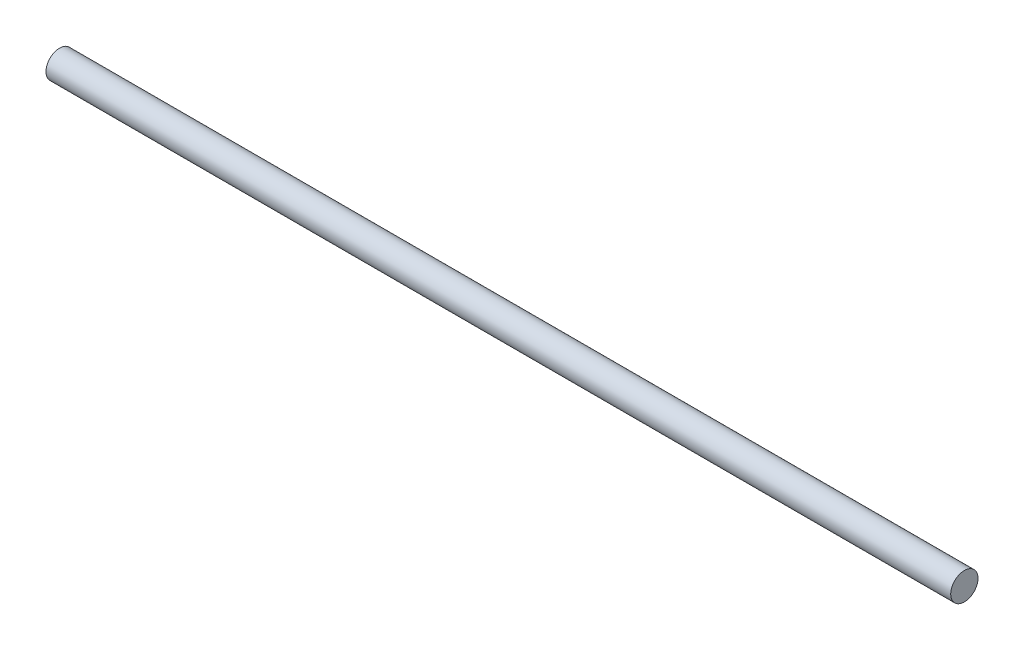
ISO-10303-21;
HEADER;
FILE_DESCRIPTION(('STEP AP214'),'2;1');
FILE_NAME('part.step','',(''),(''),'','','');
FILE_SCHEMA(('AUTOMOTIVE_DESIGN { 1 0 10303 214 1 1 1 1 }'));
ENDSEC;
DATA;
#1=APPLICATION_CONTEXT('core data for automotive mechanical design processes');
#2=APPLICATION_PROTOCOL_DEFINITION('international standard','automotive_design',2000,#1);
#3=PRODUCT_CONTEXT('',#1,'mechanical');
#4=PRODUCT('Part','Part','',(#3));
#5=PRODUCT_RELATED_PRODUCT_CATEGORY('part','',(#4));
#6=PRODUCT_DEFINITION_FORMATION('','',#4);
#7=PRODUCT_DEFINITION_CONTEXT('part definition',#1,'design');
#8=PRODUCT_DEFINITION('design','',#6,#7);
#9=PRODUCT_DEFINITION_SHAPE('','',#8);
#10=(LENGTH_UNIT() NAMED_UNIT(*) SI_UNIT(.MILLI.,.METRE.));
#11=(NAMED_UNIT(*) PLANE_ANGLE_UNIT() SI_UNIT($,.RADIAN.));
#12=(NAMED_UNIT(*) SI_UNIT($,.STERADIAN.) SOLID_ANGLE_UNIT());
#13=UNCERTAINTY_MEASURE_WITH_UNIT(LENGTH_MEASURE(1.E-05),#10,'distance_accuracy_value','');
#14=(GEOMETRIC_REPRESENTATION_CONTEXT(3) GLOBAL_UNCERTAINTY_ASSIGNED_CONTEXT((#13)) GLOBAL_UNIT_ASSIGNED_CONTEXT((#10,
#11,#12)) REPRESENTATION_CONTEXT('',''));
#15=CARTESIAN_POINT('',(0.,0.,0.));
#16=DIRECTION('',(0.,0.,1.));
#17=DIRECTION('',(1.,0.,0.));
#18=AXIS2_PLACEMENT_3D('',#15,#16,#17);
#19=CARTESIAN_POINT('',(497.5,0.,0.));
#20=DIRECTION('',(-1.,0.,0.));
#21=DIRECTION('',(0.,0.,-1.));
#22=AXIS2_PLACEMENT_3D('',#19,#20,#21);
#23=CYLINDRICAL_SURFACE('',#22,7.5);
#24=CARTESIAN_POINT('',(497.5,0.,0.));
#25=DIRECTION('',(-1.,0.,0.));
#26=DIRECTION('',(0.,0.,1.));
#27=AXIS2_PLACEMENT_3D('',#24,#25,#26);
#28=CIRCLE('',#27,7.5);
#29=CARTESIAN_POINT('',(497.5,0.,-7.5));
#30=VERTEX_POINT('',#29);
#31=EDGE_CURVE('E10',#30,#30,#28,.T.);
#32=CARTESIAN_POINT('',(0.,0.,0.));
#33=DIRECTION('',(-1.,0.,0.));
#34=DIRECTION('',(0.,0.,1.));
#35=AXIS2_PLACEMENT_3D('',#32,#33,#34);
#36=CIRCLE('',#35,7.5);
#37=CARTESIAN_POINT('',(0.,0.,-7.5));
#38=VERTEX_POINT('',#37);
#39=EDGE_CURVE('E38',#38,#38,#36,.T.);
#40=CARTESIAN_POINT('',(497.5,0.,-7.5));
#41=CARTESIAN_POINT('',(492.317708333333,0.,-7.5));
#42=CARTESIAN_POINT('',(487.135416666667,0.,-7.5));
#43=CARTESIAN_POINT('',(476.770833333333,0.,-7.5));
#44=CARTESIAN_POINT('',(471.588541666667,0.,-7.5));
#45=CARTESIAN_POINT('',(461.223958333333,0.,-7.5));
#46=CARTESIAN_POINT('',(456.041666666667,0.,-7.5));
#47=CARTESIAN_POINT('',(445.677083333333,0.,-7.5));
#48=CARTESIAN_POINT('',(440.494791666667,0.,-7.5));
#49=CARTESIAN_POINT('',(430.130208333333,0.,-7.5));
#50=CARTESIAN_POINT('',(424.947916666667,0.,-7.5));
#51=CARTESIAN_POINT('',(414.583333333333,0.,-7.5));
#52=CARTESIAN_POINT('',(409.401041666667,0.,-7.5));
#53=CARTESIAN_POINT('',(399.036458333333,0.,-7.5));
#54=CARTESIAN_POINT('',(393.854166666667,0.,-7.5));
#55=CARTESIAN_POINT('',(383.489583333333,0.,-7.5));
#56=CARTESIAN_POINT('',(378.307291666667,0.,-7.5));
#57=CARTESIAN_POINT('',(367.942708333333,0.,-7.5));
#58=CARTESIAN_POINT('',(362.760416666667,0.,-7.5));
#59=CARTESIAN_POINT('',(352.395833333333,0.,-7.5));
#60=CARTESIAN_POINT('',(347.213541666667,0.,-7.5));
#61=CARTESIAN_POINT('',(336.848958333333,0.,-7.5));
#62=CARTESIAN_POINT('',(331.666666666667,0.,-7.5));
#63=CARTESIAN_POINT('',(321.302083333333,0.,-7.5));
#64=CARTESIAN_POINT('',(316.119791666667,0.,-7.5));
#65=CARTESIAN_POINT('',(305.755208333333,0.,-7.5));
#66=CARTESIAN_POINT('',(300.572916666667,0.,-7.5));
#67=CARTESIAN_POINT('',(290.208333333333,0.,-7.5));
#68=CARTESIAN_POINT('',(285.026041666667,0.,-7.5));
#69=CARTESIAN_POINT('',(274.661458333333,0.,-7.5));
#70=CARTESIAN_POINT('',(269.479166666667,0.,-7.5));
#71=CARTESIAN_POINT('',(259.114583333333,0.,-7.5));
#72=CARTESIAN_POINT('',(253.932291666667,0.,-7.5));
#73=CARTESIAN_POINT('',(243.567708333333,0.,-7.5));
#74=CARTESIAN_POINT('',(238.385416666667,0.,-7.5));
#75=CARTESIAN_POINT('',(228.020833333333,0.,-7.5));
#76=CARTESIAN_POINT('',(222.838541666667,0.,-7.5));
#77=CARTESIAN_POINT('',(212.473958333333,0.,-7.5));
#78=CARTESIAN_POINT('',(207.291666666667,0.,-7.5));
#79=CARTESIAN_POINT('',(196.927083333333,0.,-7.5));
#80=CARTESIAN_POINT('',(191.744791666667,0.,-7.5));
#81=CARTESIAN_POINT('',(181.380208333333,0.,-7.5));
#82=CARTESIAN_POINT('',(176.197916666667,0.,-7.5));
#83=CARTESIAN_POINT('',(165.833333333333,0.,-7.5));
#84=CARTESIAN_POINT('',(160.651041666667,0.,-7.5));
#85=CARTESIAN_POINT('',(150.286458333333,0.,-7.5));
#86=CARTESIAN_POINT('',(145.104166666667,0.,-7.5));
#87=CARTESIAN_POINT('',(134.739583333333,0.,-7.5));
#88=CARTESIAN_POINT('',(129.557291666667,0.,-7.5));
#89=CARTESIAN_POINT('',(119.192708333333,0.,-7.5));
#90=CARTESIAN_POINT('',(114.010416666667,0.,-7.5));
#91=CARTESIAN_POINT('',(103.645833333333,0.,-7.5));
#92=CARTESIAN_POINT('',(98.4635416666667,0.,-7.5));
#93=CARTESIAN_POINT('',(88.0989583333333,0.,-7.5));
#94=CARTESIAN_POINT('',(82.9166666666667,0.,-7.5));
#95=CARTESIAN_POINT('',(72.5520833333334,0.,-7.5));
#96=CARTESIAN_POINT('',(67.3697916666667,0.,-7.5));
#97=CARTESIAN_POINT('',(57.0052083333333,0.,-7.5));
#98=CARTESIAN_POINT('',(51.8229166666667,0.,-7.5));
#99=CARTESIAN_POINT('',(41.4583333333333,0.,-7.5));
#100=CARTESIAN_POINT('',(36.2760416666667,0.,-7.5));
#101=CARTESIAN_POINT('',(25.9114583333334,0.,-7.5));
#102=CARTESIAN_POINT('',(20.7291666666667,0.,-7.5));
#103=CARTESIAN_POINT('',(10.3645833333333,0.,-7.5));
#104=CARTESIAN_POINT('',(5.18229166666668,0.,-7.5));
#105=CARTESIAN_POINT('',(0.,0.,-7.5));
#106=B_SPLINE_CURVE_WITH_KNOTS('',3,(#40,#41,#42,#43,#44,#45,#46,#47,#48,#49,#50,#51,#52,#53,
#54,#55,#56,#57,#58,#59,#60,#61,#62,#63,#64,#65,#66,#67,#68,#69,#70,#71,#72,#73,#74,#75,#76,#77,
#78,#79,#80,#81,#82,#83,#84,#85,#86,#87,#88,#89,#90,#91,#92,#93,#94,#95,#96,#97,#98,#99,#100,
#101,#102,#103,#104,#105),.UNSPECIFIED.,.F.,.F.,(4,2,2,2,2,2,2,2,2,2,2,2,2,2,2,2,2,2,2,2,2,2,2,
2,2,2,2,2,2,2,2,2,4),(0.,15.546875,31.09375,46.640625,62.1875,77.734375,93.28125,108.828125,
124.375,139.921875,155.46875,171.015625,186.5625,202.109375,217.65625,233.203125,248.75,
264.296875,279.84375,295.390625,310.9375,326.484375,342.03125,357.578125,373.125,388.671875,
404.21875,419.765625,435.3125,450.859375,466.40625,481.953125,497.5),.UNSPECIFIED.);
#107=EDGE_CURVE('BSEAM35',#30,#38,#106,.T.);
#108=ORIENTED_EDGE('',*,*,#31,.T.);
#109=ORIENTED_EDGE('',*,*,#39,.F.);
#110=ORIENTED_EDGE('',*,*,#107,.T.);
#111=ORIENTED_EDGE('',*,*,#107,.F.);
#112=EDGE_LOOP('',(#108,#110,#109,#111));
#113=FACE_BOUND('',#112,.T.);
#114=ADVANCED_FACE('F35',(#113),#23,.T.);
#115=CARTESIAN_POINT('',(497.5,0.,0.));
#116=DIRECTION('',(1.,0.,0.));
#117=DIRECTION('',(0.,0.,1.));
#118=AXIS2_PLACEMENT_3D('',#115,#116,#117);
#119=PLANE('',#118);
#120=ORIENTED_EDGE('',*,*,#31,.F.);
#121=EDGE_LOOP('',(#120));
#122=FACE_BOUND('',#121,.T.);
#123=ADVANCED_FACE('F50',(#122),#119,.T.);
#124=CARTESIAN_POINT('',(0.,0.,0.));
#125=DIRECTION('',(1.,0.,0.));
#126=DIRECTION('',(0.,0.,1.));
#127=AXIS2_PLACEMENT_3D('',#124,#125,#126);
#128=PLANE('',#127);
#129=ORIENTED_EDGE('',*,*,#39,.T.);
#130=EDGE_LOOP('',(#129));
#131=FACE_BOUND('',#130,.T.);
#132=ADVANCED_FACE('F47',(#131),#128,.F.);
#133=CLOSED_SHELL('',(#114,#123,#132));
#134=MANIFOLD_SOLID_BREP('B2',#133);
#135=ADVANCED_BREP_SHAPE_REPRESENTATION('',(#18,#134),#14);
#136=SHAPE_DEFINITION_REPRESENTATION(#9,#135);
ENDSEC;
END-ISO-10303-21;
